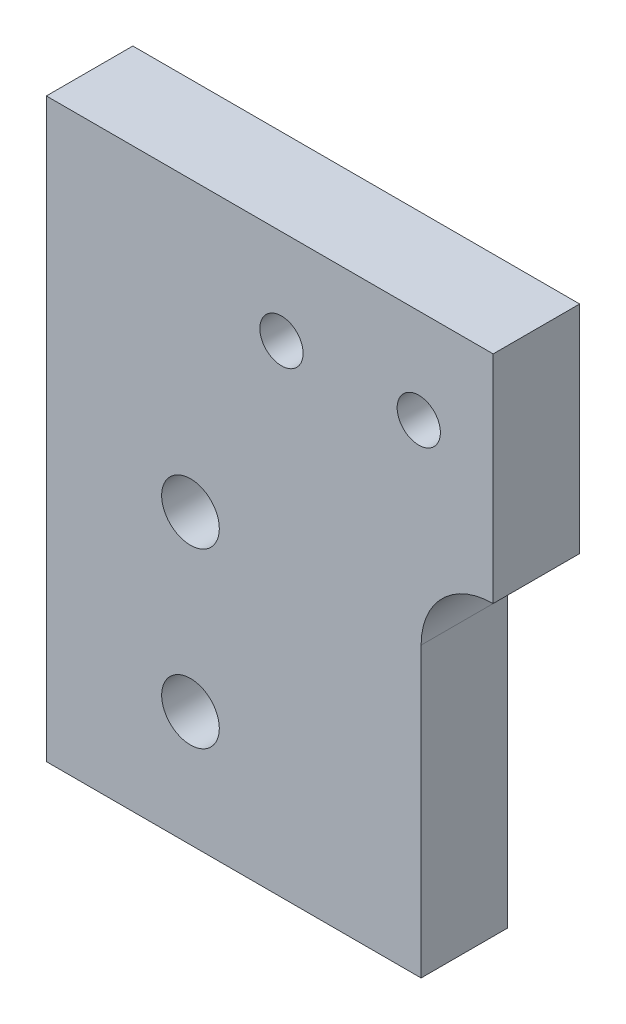
ISO-10303-21;
HEADER;
FILE_DESCRIPTION(('STEP AP214'),'2;1');
FILE_NAME('part.step','',(''),(''),'','','');
FILE_SCHEMA(('AUTOMOTIVE_DESIGN { 1 0 10303 214 1 1 1 1 }'));
ENDSEC;
DATA;
#1=APPLICATION_CONTEXT('core data for automotive mechanical design processes');
#2=APPLICATION_PROTOCOL_DEFINITION('international standard','automotive_design',2000,#1);
#3=PRODUCT_CONTEXT('',#1,'mechanical');
#4=PRODUCT('Part','Part','',(#3));
#5=PRODUCT_RELATED_PRODUCT_CATEGORY('part','',(#4));
#6=PRODUCT_DEFINITION_FORMATION('','',#4);
#7=PRODUCT_DEFINITION_CONTEXT('part definition',#1,'design');
#8=PRODUCT_DEFINITION('design','',#6,#7);
#9=PRODUCT_DEFINITION_SHAPE('','',#8);
#10=(LENGTH_UNIT() NAMED_UNIT(*) SI_UNIT(.MILLI.,.METRE.));
#11=(NAMED_UNIT(*) PLANE_ANGLE_UNIT() SI_UNIT($,.RADIAN.));
#12=(NAMED_UNIT(*) SI_UNIT($,.STERADIAN.) SOLID_ANGLE_UNIT());
#13=UNCERTAINTY_MEASURE_WITH_UNIT(LENGTH_MEASURE(1.E-05),#10,'distance_accuracy_value','');
#14=(GEOMETRIC_REPRESENTATION_CONTEXT(3) GLOBAL_UNCERTAINTY_ASSIGNED_CONTEXT((#13)) GLOBAL_UNIT_ASSIGNED_CONTEXT((#10,
#11,#12)) REPRESENTATION_CONTEXT('',''));
#15=CARTESIAN_POINT('',(0.,0.,0.));
#16=DIRECTION('',(0.,0.,1.));
#17=DIRECTION('',(1.,0.,0.));
#18=AXIS2_PLACEMENT_3D('',#15,#16,#17);
#19=CARTESIAN_POINT('',(10.3375,13.4375,-4.24264068711929));
#20=DIRECTION('',(0.,0.,1.));
#21=DIRECTION('',(1.,0.,0.));
#22=AXIS2_PLACEMENT_3D('',#19,#20,#21);
#23=CYLINDRICAL_SURFACE('',#22,1.5);
#24=CARTESIAN_POINT('',(10.3375,13.4375,6.));
#25=DIRECTION('',(0.,0.,1.));
#26=DIRECTION('',(1.,0.,0.));
#27=AXIS2_PLACEMENT_3D('',#24,#25,#26);
#28=CIRCLE('',#27,1.5);
#29=CARTESIAN_POINT('',(11.8375,13.4375,6.));
#30=VERTEX_POINT('',#29);
#31=EDGE_CURVE('E151',#30,#30,#28,.T.);
#32=ORIENTED_EDGE('',*,*,#31,.T.);
#33=EDGE_LOOP('',(#32));
#34=FACE_BOUND('',#33,.T.);
#35=CARTESIAN_POINT('',(10.3375,13.4375,2.4));
#36=DIRECTION('',(0.,0.,-1.));
#37=DIRECTION('',(-1.,0.,0.));
#38=AXIS2_PLACEMENT_3D('',#35,#36,#37);
#39=CIRCLE('',#38,1.5);
#40=CARTESIAN_POINT('',(8.83750000000001,13.4375,2.4));
#41=VERTEX_POINT('',#40);
#42=EDGE_CURVE('E147',#41,#41,#39,.F.);
#43=ORIENTED_EDGE('',*,*,#42,.F.);
#44=EDGE_LOOP('',(#43));
#45=FACE_BOUND('',#44,.T.);
#46=ADVANCED_FACE('F35',(#34,#45),#23,.F.);
#47=CARTESIAN_POINT('',(0.812500000000006,13.4375,-4.24264068711929));
#48=DIRECTION('',(0.,0.,1.));
#49=DIRECTION('',(1.,0.,0.));
#50=AXIS2_PLACEMENT_3D('',#47,#48,#49);
#51=CYLINDRICAL_SURFACE('',#50,1.5);
#52=CARTESIAN_POINT('',(0.812500000000006,13.4375,6.));
#53=DIRECTION('',(0.,0.,1.));
#54=DIRECTION('',(1.,0.,0.));
#55=AXIS2_PLACEMENT_3D('',#52,#53,#54);
#56=CIRCLE('',#55,1.5);
#57=CARTESIAN_POINT('',(2.31250000000001,13.4375,6.));
#58=VERTEX_POINT('',#57);
#59=EDGE_CURVE('E121',#58,#58,#56,.T.);
#60=ORIENTED_EDGE('',*,*,#59,.T.);
#61=EDGE_LOOP('',(#60));
#62=FACE_BOUND('',#61,.T.);
#63=CARTESIAN_POINT('',(0.812500000000006,13.4375,2.4));
#64=DIRECTION('',(0.,0.,-1.));
#65=DIRECTION('',(-1.,0.,0.));
#66=AXIS2_PLACEMENT_3D('',#63,#64,#65);
#67=CIRCLE('',#66,1.5);
#68=CARTESIAN_POINT('',(-0.687499999999994,13.4375,2.4));
#69=VERTEX_POINT('',#68);
#70=EDGE_CURVE('E144',#69,#69,#67,.F.);
#71=ORIENTED_EDGE('',*,*,#70,.F.);
#72=EDGE_LOOP('',(#71));
#73=FACE_BOUND('',#72,.T.);
#74=ADVANCED_FACE('F215',(#62,#73),#51,.F.);
#75=CARTESIAN_POINT('',(15.5,20.,6.));
#76=DIRECTION('',(-1.,0.,0.));
#77=DIRECTION('',(0.,-1.,0.));
#78=AXIS2_PLACEMENT_3D('',#75,#76,#77);
#79=PLANE('',#78);
#80=DIRECTION('',(0.,1.,0.));
#81=VECTOR('',#80,1.);
#82=CARTESIAN_POINT('',(15.5,20.,6.));
#83=LINE('',#82,#81);
#84=CARTESIAN_POINT('',(15.5,4.99999999999999,6.));
#85=VERTEX_POINT('',#84);
#86=CARTESIAN_POINT('',(15.5,20.,6.));
#87=VERTEX_POINT('',#86);
#88=EDGE_CURVE('E90',#85,#87,#83,.T.);
#89=ORIENTED_EDGE('',*,*,#88,.F.);
#90=DIRECTION('',(0.,0.,1.));
#91=VECTOR('',#90,1.);
#92=CARTESIAN_POINT('',(15.5,4.99999999999999,-25.4950975679639));
#93=LINE('',#92,#91);
#94=CARTESIAN_POINT('',(15.5,4.99999999999999,0.));
#95=VERTEX_POINT('',#94);
#96=EDGE_CURVE('E98',#95,#85,#93,.T.);
#97=ORIENTED_EDGE('',*,*,#96,.F.);
#98=DIRECTION('',(0.,1.,0.));
#99=VECTOR('',#98,1.);
#100=CARTESIAN_POINT('',(15.5,20.,0.));
#101=LINE('',#100,#99);
#102=CARTESIAN_POINT('',(15.5,20.,0.));
#103=VERTEX_POINT('',#102);
#104=EDGE_CURVE('E130',#95,#103,#101,.T.);
#105=ORIENTED_EDGE('',*,*,#104,.T.);
#106=DIRECTION('',(0.,0.,-1.));
#107=VECTOR('',#106,1.);
#108=CARTESIAN_POINT('',(15.5,20.,6.));
#109=LINE('',#108,#107);
#110=EDGE_CURVE('E100',#87,#103,#109,.T.);
#111=ORIENTED_EDGE('',*,*,#110,.F.);
#112=EDGE_LOOP('',(#89,#97,#105,#111));
#113=FACE_BOUND('',#112,.T.);
#114=ADVANCED_FACE('F97',(#113),#79,.F.);
#115=CARTESIAN_POINT('',(-15.5,20.,6.));
#116=DIRECTION('',(0.,-1.,0.));
#117=DIRECTION('',(0.,0.,-1.));
#118=AXIS2_PLACEMENT_3D('',#115,#116,#117);
#119=PLANE('',#118);
#120=DIRECTION('',(-1.,0.,0.));
#121=VECTOR('',#120,1.);
#122=CARTESIAN_POINT('',(-15.5,20.,0.));
#123=LINE('',#122,#121);
#124=CARTESIAN_POINT('',(-15.5,20.,0.));
#125=VERTEX_POINT('',#124);
#126=EDGE_CURVE('E132',#103,#125,#123,.T.);
#127=ORIENTED_EDGE('',*,*,#126,.T.);
#128=DIRECTION('',(0.,0.,-1.));
#129=VECTOR('',#128,1.);
#130=CARTESIAN_POINT('',(-15.5,20.,6.));
#131=LINE('',#130,#129);
#132=CARTESIAN_POINT('',(-15.5,20.,6.));
#133=VERTEX_POINT('',#132);
#134=EDGE_CURVE('E140',#133,#125,#131,.T.);
#135=ORIENTED_EDGE('',*,*,#134,.F.);
#136=DIRECTION('',(-1.,0.,0.));
#137=VECTOR('',#136,1.);
#138=CARTESIAN_POINT('',(-15.5,20.,6.));
#139=LINE('',#138,#137);
#140=EDGE_CURVE('E101',#87,#133,#139,.T.);
#141=ORIENTED_EDGE('',*,*,#140,.F.);
#142=ORIENTED_EDGE('',*,*,#110,.T.);
#143=EDGE_LOOP('',(#127,#135,#141,#142));
#144=FACE_BOUND('',#143,.T.);
#145=ADVANCED_FACE('F197',(#144),#119,.F.);
#146=CARTESIAN_POINT('',(-15.5,20.,6.));
#147=DIRECTION('',(1.,0.,0.));
#148=DIRECTION('',(0.,1.,0.));
#149=AXIS2_PLACEMENT_3D('',#146,#147,#148);
#150=PLANE('',#149);
#151=DIRECTION('',(0.,-1.,0.));
#152=VECTOR('',#151,1.);
#153=CARTESIAN_POINT('',(-15.5,20.,0.));
#154=LINE('',#153,#152);
#155=CARTESIAN_POINT('',(-15.5,-20.,0.));
#156=VERTEX_POINT('',#155);
#157=EDGE_CURVE('E134',#125,#156,#154,.T.);
#158=ORIENTED_EDGE('',*,*,#157,.T.);
#159=DIRECTION('',(0.,0.,-1.));
#160=VECTOR('',#159,1.);
#161=CARTESIAN_POINT('',(-15.5,-20.,6.));
#162=LINE('',#161,#160);
#163=CARTESIAN_POINT('',(-15.5,-20.,6.));
#164=VERTEX_POINT('',#163);
#165=EDGE_CURVE('E129',#164,#156,#162,.T.);
#166=ORIENTED_EDGE('',*,*,#165,.F.);
#167=DIRECTION('',(0.,-1.,0.));
#168=VECTOR('',#167,1.);
#169=CARTESIAN_POINT('',(-15.5,20.,6.));
#170=LINE('',#169,#168);
#171=EDGE_CURVE('E125',#133,#164,#170,.T.);
#172=ORIENTED_EDGE('',*,*,#171,.F.);
#173=ORIENTED_EDGE('',*,*,#134,.T.);
#174=EDGE_LOOP('',(#158,#166,#172,#173));
#175=FACE_BOUND('',#174,.T.);
#176=ADVANCED_FACE('F202',(#175),#150,.F.);
#177=CARTESIAN_POINT('',(-15.5,-20.,6.));
#178=DIRECTION('',(0.,1.,0.));
#179=DIRECTION('',(0.,0.,1.));
#180=AXIS2_PLACEMENT_3D('',#177,#178,#179);
#181=PLANE('',#180);
#182=DIRECTION('',(1.,0.,0.));
#183=VECTOR('',#182,1.);
#184=CARTESIAN_POINT('',(-15.5,-20.,0.));
#185=LINE('',#184,#183);
#186=CARTESIAN_POINT('',(10.5,-20.,0.));
#187=VERTEX_POINT('',#186);
#188=EDGE_CURVE('E102',#156,#187,#185,.T.);
#189=ORIENTED_EDGE('',*,*,#188,.T.);
#190=DIRECTION('',(0.,0.,1.));
#191=VECTOR('',#190,1.);
#192=CARTESIAN_POINT('',(10.5,-20.,-25.4950975679639));
#193=LINE('',#192,#191);
#194=CARTESIAN_POINT('',(10.5,-20.,6.));
#195=VERTEX_POINT('',#194);
#196=EDGE_CURVE('E104',#187,#195,#193,.T.);
#197=ORIENTED_EDGE('',*,*,#196,.T.);
#198=DIRECTION('',(1.,0.,0.));
#199=VECTOR('',#198,1.);
#200=CARTESIAN_POINT('',(-15.5,-20.,6.));
#201=LINE('',#200,#199);
#202=EDGE_CURVE('E127',#164,#195,#201,.T.);
#203=ORIENTED_EDGE('',*,*,#202,.F.);
#204=ORIENTED_EDGE('',*,*,#165,.T.);
#205=EDGE_LOOP('',(#189,#197,#203,#204));
#206=FACE_BOUND('',#205,.T.);
#207=ADVANCED_FACE('F204',(#206),#181,.F.);
#208=CARTESIAN_POINT('',(0.,0.,6.));
#209=DIRECTION('',(0.,0.,1.));
#210=DIRECTION('',(1.,0.,0.));
#211=AXIS2_PLACEMENT_3D('',#208,#209,#210);
#212=PLANE('',#211);
#213=ORIENTED_EDGE('',*,*,#59,.F.);
#214=EDGE_LOOP('',(#213));
#215=FACE_BOUND('',#214,.T.);
#216=ORIENTED_EDGE('',*,*,#31,.F.);
#217=EDGE_LOOP('',(#216));
#218=FACE_BOUND('',#217,.T.);
#219=DIRECTION('',(0.,-1.,0.));
#220=VECTOR('',#219,1.);
#221=CARTESIAN_POINT('',(10.5,-20.,6.));
#222=LINE('',#221,#220);
#223=CARTESIAN_POINT('',(10.5,0.,6.));
#224=VERTEX_POINT('',#223);
#225=EDGE_CURVE('E93',#224,#195,#222,.T.);
#226=ORIENTED_EDGE('',*,*,#225,.F.);
#227=CARTESIAN_POINT('',(15.5,0.,6.));
#228=DIRECTION('',(0.,0.,1.));
#229=DIRECTION('',(1.,0.,0.));
#230=AXIS2_PLACEMENT_3D('',#227,#228,#229);
#231=CIRCLE('',#230,5.);
#232=EDGE_CURVE('E43',#224,#85,#231,.F.);
#233=ORIENTED_EDGE('',*,*,#232,.T.);
#234=ORIENTED_EDGE('',*,*,#88,.T.);
#235=ORIENTED_EDGE('',*,*,#140,.T.);
#236=ORIENTED_EDGE('',*,*,#171,.T.);
#237=ORIENTED_EDGE('',*,*,#202,.T.);
#238=EDGE_LOOP('',(#226,#233,#234,#235,#236,#237));
#239=FACE_BOUND('',#238,.T.);
#240=CARTESIAN_POINT('',(-5.49999999999999,-12.,6.));
#241=DIRECTION('',(0.,0.,1.));
#242=DIRECTION('',(1.,0.,0.));
#243=AXIS2_PLACEMENT_3D('',#240,#241,#242);
#244=CIRCLE('',#243,2.);
#245=CARTESIAN_POINT('',(-3.49999999999999,-12.,6.));
#246=VERTEX_POINT('',#245);
#247=EDGE_CURVE('E112',#246,#246,#244,.T.);
#248=ORIENTED_EDGE('',*,*,#247,.F.);
#249=EDGE_LOOP('',(#248));
#250=FACE_BOUND('',#249,.T.);
#251=CARTESIAN_POINT('',(-5.49999999999999,0.,6.));
#252=DIRECTION('',(0.,0.,1.));
#253=DIRECTION('',(1.,0.,0.));
#254=AXIS2_PLACEMENT_3D('',#251,#252,#253);
#255=CIRCLE('',#254,2.);
#256=CARTESIAN_POINT('',(-3.49999999999999,0.,6.));
#257=VERTEX_POINT('',#256);
#258=EDGE_CURVE('E118',#257,#257,#255,.T.);
#259=ORIENTED_EDGE('',*,*,#258,.F.);
#260=EDGE_LOOP('',(#259));
#261=FACE_BOUND('',#260,.T.);
#262=ADVANCED_FACE('F88',(#215,#218,#239,#250,#261),#212,.T.);
#263=CARTESIAN_POINT('',(0.,0.,0.));
#264=DIRECTION('',(0.,0.,1.));
#265=DIRECTION('',(1.,0.,0.));
#266=AXIS2_PLACEMENT_3D('',#263,#264,#265);
#267=PLANE('',#266);
#268=CARTESIAN_POINT('',(0.812500000000006,13.4375,0.));
#269=DIRECTION('',(0.,0.,-1.));
#270=DIRECTION('',(-1.,0.,0.));
#271=AXIS2_PLACEMENT_3D('',#268,#269,#270);
#272=CIRCLE('',#271,2.5);
#273=CARTESIAN_POINT('',(-1.68749999999999,13.4375,0.));
#274=VERTEX_POINT('',#273);
#275=EDGE_CURVE('E167',#274,#274,#272,.T.);
#276=ORIENTED_EDGE('',*,*,#275,.F.);
#277=EDGE_LOOP('',(#276));
#278=FACE_BOUND('',#277,.T.);
#279=CARTESIAN_POINT('',(10.3375,13.4375,0.));
#280=DIRECTION('',(0.,0.,-1.));
#281=DIRECTION('',(-1.,0.,0.));
#282=AXIS2_PLACEMENT_3D('',#279,#280,#281);
#283=CIRCLE('',#282,2.5);
#284=CARTESIAN_POINT('',(7.83750000000001,13.4375,0.));
#285=VERTEX_POINT('',#284);
#286=EDGE_CURVE('E161',#285,#285,#283,.T.);
#287=ORIENTED_EDGE('',*,*,#286,.F.);
#288=EDGE_LOOP('',(#287));
#289=FACE_BOUND('',#288,.T.);
#290=CARTESIAN_POINT('',(-5.49999999999999,-12.,0.));
#291=DIRECTION('',(0.,0.,1.));
#292=DIRECTION('',(1.,0.,0.));
#293=AXIS2_PLACEMENT_3D('',#290,#291,#292);
#294=CIRCLE('',#293,2.);
#295=CARTESIAN_POINT('',(-3.49999999999999,-12.,0.));
#296=VERTEX_POINT('',#295);
#297=EDGE_CURVE('E109',#296,#296,#294,.F.);
#298=ORIENTED_EDGE('',*,*,#297,.F.);
#299=EDGE_LOOP('',(#298));
#300=FACE_BOUND('',#299,.T.);
#301=CARTESIAN_POINT('',(-5.49999999999999,0.,0.));
#302=DIRECTION('',(0.,0.,1.));
#303=DIRECTION('',(1.,0.,0.));
#304=AXIS2_PLACEMENT_3D('',#301,#302,#303);
#305=CIRCLE('',#304,2.);
#306=CARTESIAN_POINT('',(-3.49999999999999,0.,0.));
#307=VERTEX_POINT('',#306);
#308=EDGE_CURVE('E115',#307,#307,#305,.F.);
#309=ORIENTED_EDGE('',*,*,#308,.F.);
#310=EDGE_LOOP('',(#309));
#311=FACE_BOUND('',#310,.T.);
#312=ORIENTED_EDGE('',*,*,#104,.F.);
#313=CARTESIAN_POINT('',(15.5,0.,0.));
#314=DIRECTION('',(0.,0.,1.));
#315=DIRECTION('',(1.,0.,0.));
#316=AXIS2_PLACEMENT_3D('',#313,#314,#315);
#317=CIRCLE('',#316,5.);
#318=CARTESIAN_POINT('',(10.5,0.,0.));
#319=VERTEX_POINT('',#318);
#320=EDGE_CURVE('E11',#95,#319,#317,.T.);
#321=ORIENTED_EDGE('',*,*,#320,.T.);
#322=DIRECTION('',(0.,1.,0.));
#323=VECTOR('',#322,1.);
#324=CARTESIAN_POINT('',(10.5,-20.,0.));
#325=LINE('',#324,#323);
#326=EDGE_CURVE('E107',#187,#319,#325,.T.);
#327=ORIENTED_EDGE('',*,*,#326,.F.);
#328=ORIENTED_EDGE('',*,*,#188,.F.);
#329=ORIENTED_EDGE('',*,*,#157,.F.);
#330=ORIENTED_EDGE('',*,*,#126,.F.);
#331=EDGE_LOOP('',(#312,#321,#327,#328,#329,#330));
#332=FACE_BOUND('',#331,.T.);
#333=ADVANCED_FACE('F183',(#278,#289,#300,#311,#332),#267,.F.);
#334=CARTESIAN_POINT('',(-5.49999999999999,0.,-25.4950975679639));
#335=DIRECTION('',(0.,0.,1.));
#336=DIRECTION('',(1.,0.,0.));
#337=AXIS2_PLACEMENT_3D('',#334,#335,#336);
#338=CYLINDRICAL_SURFACE('',#337,2.);
#339=ORIENTED_EDGE('',*,*,#308,.T.);
#340=EDGE_LOOP('',(#339));
#341=FACE_BOUND('',#340,.T.);
#342=ORIENTED_EDGE('',*,*,#258,.T.);
#343=EDGE_LOOP('',(#342));
#344=FACE_BOUND('',#343,.T.);
#345=ADVANCED_FACE('F186',(#341,#344),#338,.F.);
#346=CARTESIAN_POINT('',(-5.49999999999999,-12.,-25.4950975679639));
#347=DIRECTION('',(0.,0.,1.));
#348=DIRECTION('',(1.,0.,0.));
#349=AXIS2_PLACEMENT_3D('',#346,#347,#348);
#350=CYLINDRICAL_SURFACE('',#349,2.);
#351=ORIENTED_EDGE('',*,*,#297,.T.);
#352=EDGE_LOOP('',(#351));
#353=FACE_BOUND('',#352,.T.);
#354=ORIENTED_EDGE('',*,*,#247,.T.);
#355=EDGE_LOOP('',(#354));
#356=FACE_BOUND('',#355,.T.);
#357=ADVANCED_FACE('F228',(#353,#356),#350,.F.);
#358=CARTESIAN_POINT('',(10.5,-20.,-25.4950975679639));
#359=DIRECTION('',(-1.,0.,0.));
#360=DIRECTION('',(0.,0.,1.));
#361=AXIS2_PLACEMENT_3D('',#358,#359,#360);
#362=PLANE('',#361);
#363=ORIENTED_EDGE('',*,*,#326,.T.);
#364=DIRECTION('',(0.,0.,1.));
#365=VECTOR('',#364,1.);
#366=CARTESIAN_POINT('',(10.5,0.,6.));
#367=LINE('',#366,#365);
#368=EDGE_CURVE('E94',#319,#224,#367,.T.);
#369=ORIENTED_EDGE('',*,*,#368,.T.);
#370=ORIENTED_EDGE('',*,*,#225,.T.);
#371=ORIENTED_EDGE('',*,*,#196,.F.);
#372=EDGE_LOOP('',(#363,#369,#370,#371));
#373=FACE_BOUND('',#372,.T.);
#374=ADVANCED_FACE('F153',(#373),#362,.F.);
#375=CARTESIAN_POINT('',(0.812500000000006,13.4375,2.4));
#376=DIRECTION('',(0.,0.,-1.));
#377=DIRECTION('',(-1.,0.,0.));
#378=AXIS2_PLACEMENT_3D('',#375,#376,#377);
#379=PLANE('',#378);
#380=CARTESIAN_POINT('',(0.812500000000006,13.4375,2.4));
#381=DIRECTION('',(0.,0.,-1.));
#382=DIRECTION('',(-1.,0.,0.));
#383=AXIS2_PLACEMENT_3D('',#380,#381,#382);
#384=CIRCLE('',#383,2.5);
#385=CARTESIAN_POINT('',(-1.68749999999999,13.4375,2.4));
#386=VERTEX_POINT('',#385);
#387=EDGE_CURVE('E148',#386,#386,#384,.T.);
#388=ORIENTED_EDGE('',*,*,#387,.T.);
#389=EDGE_LOOP('',(#388));
#390=FACE_BOUND('',#389,.T.);
#391=ORIENTED_EDGE('',*,*,#70,.T.);
#392=EDGE_LOOP('',(#391));
#393=FACE_BOUND('',#392,.T.);
#394=ADVANCED_FACE('F173',(#390,#393),#379,.T.);
#395=CARTESIAN_POINT('',(0.812500000000006,13.4375,2.4));
#396=DIRECTION('',(0.,0.,-1.));
#397=DIRECTION('',(-1.,0.,0.));
#398=AXIS2_PLACEMENT_3D('',#395,#396,#397);
#399=CYLINDRICAL_SURFACE('',#398,2.5);
#400=ORIENTED_EDGE('',*,*,#387,.F.);
#401=EDGE_LOOP('',(#400));
#402=FACE_BOUND('',#401,.T.);
#403=ORIENTED_EDGE('',*,*,#275,.T.);
#404=EDGE_LOOP('',(#403));
#405=FACE_BOUND('',#404,.T.);
#406=ADVANCED_FACE('F176',(#402,#405),#399,.F.);
#407=CARTESIAN_POINT('',(10.3375,13.4375,2.4));
#408=DIRECTION('',(0.,0.,-1.));
#409=DIRECTION('',(-1.,0.,0.));
#410=AXIS2_PLACEMENT_3D('',#407,#408,#409);
#411=PLANE('',#410);
#412=CARTESIAN_POINT('',(10.3375,13.4375,2.4));
#413=DIRECTION('',(0.,0.,-1.));
#414=DIRECTION('',(-1.,0.,0.));
#415=AXIS2_PLACEMENT_3D('',#412,#413,#414);
#416=CIRCLE('',#415,2.5);
#417=CARTESIAN_POINT('',(7.83750000000001,13.4375,2.4));
#418=VERTEX_POINT('',#417);
#419=EDGE_CURVE('E164',#418,#418,#416,.T.);
#420=ORIENTED_EDGE('',*,*,#419,.T.);
#421=EDGE_LOOP('',(#420));
#422=FACE_BOUND('',#421,.T.);
#423=ORIENTED_EDGE('',*,*,#42,.T.);
#424=EDGE_LOOP('',(#423));
#425=FACE_BOUND('',#424,.T.);
#426=ADVANCED_FACE('F179',(#422,#425),#411,.T.);
#427=CARTESIAN_POINT('',(10.3375,13.4375,2.4));
#428=DIRECTION('',(0.,0.,-1.));
#429=DIRECTION('',(-1.,0.,0.));
#430=AXIS2_PLACEMENT_3D('',#427,#428,#429);
#431=CYLINDRICAL_SURFACE('',#430,2.5);
#432=ORIENTED_EDGE('',*,*,#419,.F.);
#433=EDGE_LOOP('',(#432));
#434=FACE_BOUND('',#433,.T.);
#435=ORIENTED_EDGE('',*,*,#286,.T.);
#436=EDGE_LOOP('',(#435));
#437=FACE_BOUND('',#436,.T.);
#438=ADVANCED_FACE('F267',(#434,#437),#431,.F.);
#439=CARTESIAN_POINT('',(15.5,0.,-25.4950975679639));
#440=DIRECTION('',(0.,0.,-1.));
#441=DIRECTION('',(-1.,0.,0.));
#442=AXIS2_PLACEMENT_3D('',#439,#440,#441);
#443=CYLINDRICAL_SURFACE('',#442,5.);
#444=ORIENTED_EDGE('',*,*,#320,.F.);
#445=ORIENTED_EDGE('',*,*,#96,.T.);
#446=ORIENTED_EDGE('',*,*,#232,.F.);
#447=ORIENTED_EDGE('',*,*,#368,.F.);
#448=EDGE_LOOP('',(#444,#445,#446,#447));
#449=FACE_BOUND('',#448,.T.);
#450=ADVANCED_FACE('F37',(#449),#443,.F.);
#451=CLOSED_SHELL('',(#46,#74,#114,#145,#176,#207,#262,#333,#345,#357,#374,#394,#406,#426,#438,#450));
#452=MANIFOLD_SOLID_BREP('B2',#451);
#453=ADVANCED_BREP_SHAPE_REPRESENTATION('',(#18,#452),#14);
#454=SHAPE_DEFINITION_REPRESENTATION(#9,#453);
ENDSEC;
END-ISO-10303-21;
